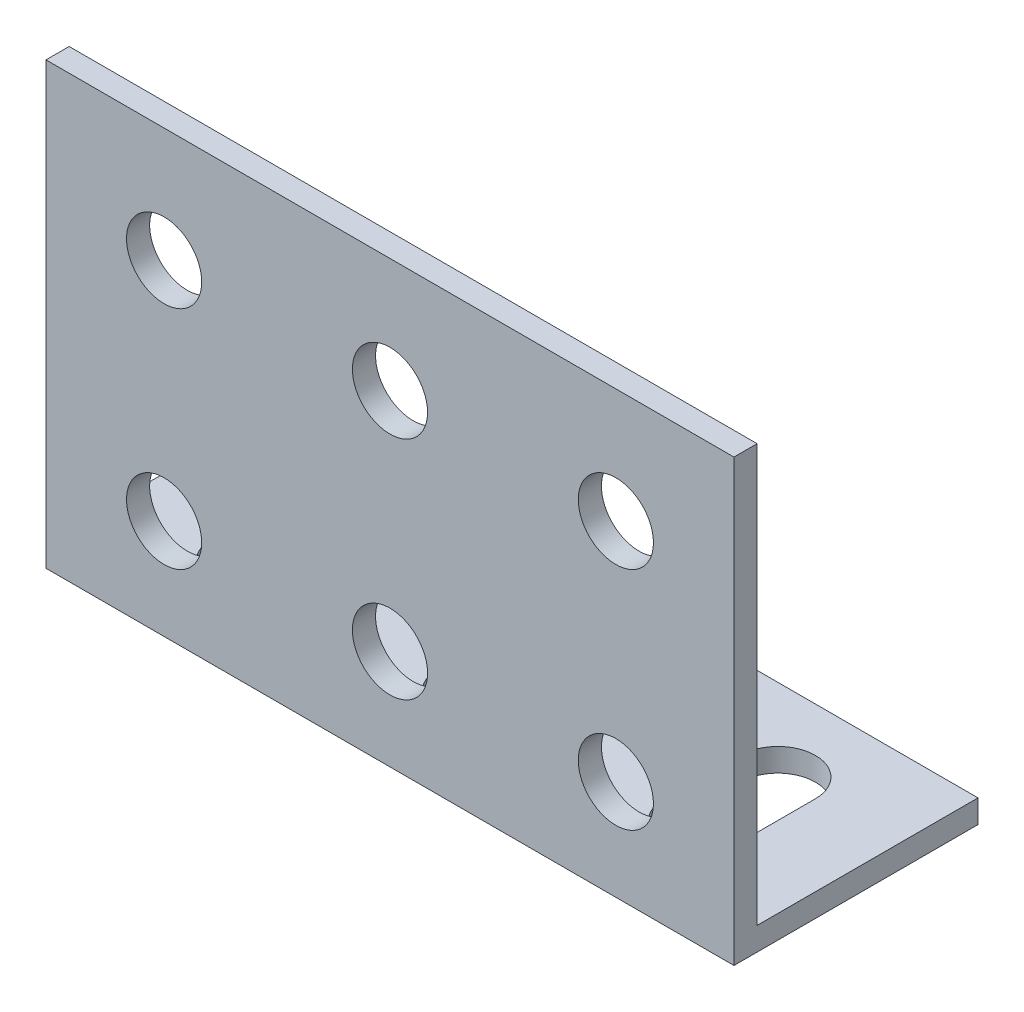
ISO-10303-21;
HEADER;
FILE_DESCRIPTION(('STEP AP214'),'2;1');
FILE_NAME('part.step','',(''),(''),'','','');
FILE_SCHEMA(('AUTOMOTIVE_DESIGN { 1 0 10303 214 1 1 1 1 }'));
ENDSEC;
DATA;
#1=APPLICATION_CONTEXT('core data for automotive mechanical design processes');
#2=APPLICATION_PROTOCOL_DEFINITION('international standard','automotive_design',2000,#1);
#3=PRODUCT_CONTEXT('',#1,'mechanical');
#4=PRODUCT('Part','Part','',(#3));
#5=PRODUCT_RELATED_PRODUCT_CATEGORY('part','',(#4));
#6=PRODUCT_DEFINITION_FORMATION('','',#4);
#7=PRODUCT_DEFINITION_CONTEXT('part definition',#1,'design');
#8=PRODUCT_DEFINITION('design','',#6,#7);
#9=PRODUCT_DEFINITION_SHAPE('','',#8);
#10=(LENGTH_UNIT() NAMED_UNIT(*) SI_UNIT(.MILLI.,.METRE.));
#11=(NAMED_UNIT(*) PLANE_ANGLE_UNIT() SI_UNIT($,.RADIAN.));
#12=(NAMED_UNIT(*) SI_UNIT($,.STERADIAN.) SOLID_ANGLE_UNIT());
#13=UNCERTAINTY_MEASURE_WITH_UNIT(LENGTH_MEASURE(1.E-05),#10,'distance_accuracy_value','');
#14=(GEOMETRIC_REPRESENTATION_CONTEXT(3) GLOBAL_UNCERTAINTY_ASSIGNED_CONTEXT((#13)) GLOBAL_UNIT_ASSIGNED_CONTEXT((#10,
#11,#12)) REPRESENTATION_CONTEXT('',''));
#15=CARTESIAN_POINT('',(0.,0.,0.));
#16=DIRECTION('',(0.,0.,1.));
#17=DIRECTION('',(1.,0.,0.));
#18=AXIS2_PLACEMENT_3D('',#15,#16,#17);
#19=CARTESIAN_POINT('',(0.,0.,-1.3));
#20=DIRECTION('',(0.,0.,1.));
#21=DIRECTION('',(1.,0.,0.));
#22=AXIS2_PLACEMENT_3D('',#19,#20,#21);
#23=PLANE('',#22);
#24=CARTESIAN_POINT('',(-33.952112536117,10.9265298567999,-1.3));
#25=DIRECTION('',(0.,0.,1.));
#26=DIRECTION('',(1.,0.,0.));
#27=AXIS2_PLACEMENT_3D('',#24,#25,#26);
#28=CIRCLE('',#27,2.11);
#29=CARTESIAN_POINT('',(-31.842112536117,10.9265298567999,-1.3));
#30=VERTEX_POINT('',#29);
#31=EDGE_CURVE('E84',#30,#30,#28,.T.);
#32=ORIENTED_EDGE('',*,*,#31,.T.);
#33=EDGE_LOOP('',(#32));
#34=FACE_BOUND('',#33,.T.);
#35=CARTESIAN_POINT('',(-21.272112536117,10.9265298567999,-1.3));
#36=DIRECTION('',(0.,0.,1.));
#37=DIRECTION('',(1.,0.,0.));
#38=AXIS2_PLACEMENT_3D('',#35,#36,#37);
#39=CIRCLE('',#38,2.11);
#40=CARTESIAN_POINT('',(-19.162112536117,10.9265298567999,-1.3));
#41=VERTEX_POINT('',#40);
#42=EDGE_CURVE('E163',#41,#41,#39,.T.);
#43=ORIENTED_EDGE('',*,*,#42,.T.);
#44=EDGE_LOOP('',(#43));
#45=FACE_BOUND('',#44,.T.);
#46=CARTESIAN_POINT('',(-8.592112536117,10.9265298567999,-1.3));
#47=DIRECTION('',(0.,0.,1.));
#48=DIRECTION('',(1.,0.,0.));
#49=AXIS2_PLACEMENT_3D('',#46,#47,#48);
#50=CIRCLE('',#49,2.11);
#51=CARTESIAN_POINT('',(-6.482112536117,10.9265298567999,-1.3));
#52=VERTEX_POINT('',#51);
#53=EDGE_CURVE('E157',#52,#52,#50,.T.);
#54=ORIENTED_EDGE('',*,*,#53,.T.);
#55=EDGE_LOOP('',(#54));
#56=FACE_BOUND('',#55,.T.);
#57=CARTESIAN_POINT('',(-21.2721125361169,-1.75347014320015,-1.3));
#58=DIRECTION('',(0.,0.,1.));
#59=DIRECTION('',(1.,0.,0.));
#60=AXIS2_PLACEMENT_3D('',#57,#58,#59);
#61=CIRCLE('',#60,2.11);
#62=CARTESIAN_POINT('',(-19.1621125361169,-1.75347014320015,-1.3));
#63=VERTEX_POINT('',#62);
#64=EDGE_CURVE('E151',#63,#63,#61,.T.);
#65=ORIENTED_EDGE('',*,*,#64,.T.);
#66=EDGE_LOOP('',(#65));
#67=FACE_BOUND('',#66,.T.);
#68=CARTESIAN_POINT('',(-8.59211253611687,-1.75347014320015,-1.3));
#69=DIRECTION('',(0.,0.,1.));
#70=DIRECTION('',(1.,0.,0.));
#71=AXIS2_PLACEMENT_3D('',#68,#69,#70);
#72=CIRCLE('',#71,2.11);
#73=CARTESIAN_POINT('',(-6.48211253611687,-1.75347014320015,-1.3));
#74=VERTEX_POINT('',#73);
#75=EDGE_CURVE('E145',#74,#74,#72,.T.);
#76=ORIENTED_EDGE('',*,*,#75,.T.);
#77=EDGE_LOOP('',(#76));
#78=FACE_BOUND('',#77,.T.);
#79=CARTESIAN_POINT('',(-33.9521125361169,-1.75347014320015,-1.3));
#80=DIRECTION('',(0.,0.,1.));
#81=DIRECTION('',(1.,0.,0.));
#82=AXIS2_PLACEMENT_3D('',#79,#80,#81);
#83=CIRCLE('',#82,2.11);
#84=CARTESIAN_POINT('',(-31.8421125361169,-1.75347014320015,-1.3));
#85=VERTEX_POINT('',#84);
#86=EDGE_CURVE('E139',#85,#85,#83,.T.);
#87=ORIENTED_EDGE('',*,*,#86,.T.);
#88=EDGE_LOOP('',(#87));
#89=FACE_BOUND('',#88,.T.);
#90=DIRECTION('',(1.,0.,0.));
#91=VECTOR('',#90,1.);
#92=CARTESIAN_POINT('',(0.,-6.06347014320015,-1.3));
#93=LINE('',#92,#91);
#94=CARTESIAN_POINT('',(-40.582112536117,-6.06347014320015,-1.3));
#95=VERTEX_POINT('',#94);
#96=CARTESIAN_POINT('',(-1.96211253611701,-6.06347014320015,-1.3));
#97=VERTEX_POINT('',#96);
#98=EDGE_CURVE('E134',#95,#97,#93,.T.);
#99=ORIENTED_EDGE('',*,*,#98,.F.);
#100=DIRECTION('',(0.,-1.,0.));
#101=VECTOR('',#100,1.);
#102=CARTESIAN_POINT('',(-40.582112536117,17.3565298567999,-1.3));
#103=LINE('',#102,#101);
#104=CARTESIAN_POINT('',(-40.582112536117,17.3565298567999,-1.3));
#105=VERTEX_POINT('',#104);
#106=EDGE_CURVE('E88',#105,#95,#103,.T.);
#107=ORIENTED_EDGE('',*,*,#106,.F.);
#108=DIRECTION('',(-1.,0.,0.));
#109=VECTOR('',#108,1.);
#110=CARTESIAN_POINT('',(-40.582112536117,17.3565298567999,-1.3));
#111=LINE('',#110,#109);
#112=CARTESIAN_POINT('',(-1.96211253611701,17.3565298567999,-1.3));
#113=VERTEX_POINT('',#112);
#114=EDGE_CURVE('E77',#113,#105,#111,.T.);
#115=ORIENTED_EDGE('',*,*,#114,.F.);
#116=DIRECTION('',(0.,1.,0.));
#117=VECTOR('',#116,1.);
#118=CARTESIAN_POINT('',(-1.96211253611701,17.3565298567999,-1.3));
#119=LINE('',#118,#117);
#120=EDGE_CURVE('E90',#97,#113,#119,.T.);
#121=ORIENTED_EDGE('',*,*,#120,.F.);
#122=EDGE_LOOP('',(#99,#107,#115,#121));
#123=FACE_BOUND('',#122,.T.);
#124=ADVANCED_FACE('F33',(#34,#45,#56,#67,#78,#89,#123),#23,.F.);
#125=CARTESIAN_POINT('',(-40.582112536117,17.3565298567999,-1.3));
#126=DIRECTION('',(-1.,0.,0.));
#127=DIRECTION('',(0.,0.,1.));
#128=AXIS2_PLACEMENT_3D('',#125,#126,#127);
#129=PLANE('',#128);
#130=DIRECTION('',(0.,0.,1.));
#131=VECTOR('',#130,1.);
#132=CARTESIAN_POINT('',(-40.582112536117,-7.36347014320015,-1.3));
#133=LINE('',#132,#131);
#134=CARTESIAN_POINT('',(-40.582112536117,-7.36347014320015,-13.7));
#135=VERTEX_POINT('',#134);
#136=CARTESIAN_POINT('',(-40.582112536117,-7.36347014320015,0.));
#137=VERTEX_POINT('',#136);
#138=EDGE_CURVE('E37',#135,#137,#133,.T.);
#139=ORIENTED_EDGE('',*,*,#138,.T.);
#140=DIRECTION('',(0.,-1.,0.));
#141=VECTOR('',#140,1.);
#142=CARTESIAN_POINT('',(-40.582112536117,17.3565298567999,0.));
#143=LINE('',#142,#141);
#144=CARTESIAN_POINT('',(-40.582112536117,17.3565298567999,0.));
#145=VERTEX_POINT('',#144);
#146=EDGE_CURVE('E79',#145,#137,#143,.T.);
#147=ORIENTED_EDGE('',*,*,#146,.F.);
#148=DIRECTION('',(0.,0.,1.));
#149=VECTOR('',#148,1.);
#150=CARTESIAN_POINT('',(-40.582112536117,17.3565298567999,-1.3));
#151=LINE('',#150,#149);
#152=EDGE_CURVE('E11',#105,#145,#151,.T.);
#153=ORIENTED_EDGE('',*,*,#152,.F.);
#154=ORIENTED_EDGE('',*,*,#106,.T.);
#155=DIRECTION('',(0.,0.,-1.));
#156=VECTOR('',#155,1.);
#157=CARTESIAN_POINT('',(-40.582112536117,-6.06347014320015,0.));
#158=LINE('',#157,#156);
#159=CARTESIAN_POINT('',(-40.582112536117,-6.06347014320015,-13.7));
#160=VERTEX_POINT('',#159);
#161=EDGE_CURVE('E114',#95,#160,#158,.T.);
#162=ORIENTED_EDGE('',*,*,#161,.T.);
#163=DIRECTION('',(0.,-1.,0.));
#164=VECTOR('',#163,1.);
#165=CARTESIAN_POINT('',(-40.582112536117,-6.06347014320015,-13.7));
#166=LINE('',#165,#164);
#167=EDGE_CURVE('E111',#160,#135,#166,.T.);
#168=ORIENTED_EDGE('',*,*,#167,.T.);
#169=EDGE_LOOP('',(#139,#147,#153,#154,#162,#168));
#170=FACE_BOUND('',#169,.T.);
#171=ADVANCED_FACE('F35',(#170),#129,.T.);
#172=CARTESIAN_POINT('',(-40.582112536117,17.3565298567999,-1.3));
#173=DIRECTION('',(0.,1.,0.));
#174=DIRECTION('',(0.,0.,1.));
#175=AXIS2_PLACEMENT_3D('',#172,#173,#174);
#176=PLANE('',#175);
#177=DIRECTION('',(-1.,0.,0.));
#178=VECTOR('',#177,1.);
#179=CARTESIAN_POINT('',(-40.582112536117,17.3565298567999,0.));
#180=LINE('',#179,#178);
#181=CARTESIAN_POINT('',(-1.96211253611701,17.3565298567999,0.));
#182=VERTEX_POINT('',#181);
#183=EDGE_CURVE('E75',#182,#145,#180,.T.);
#184=ORIENTED_EDGE('',*,*,#183,.F.);
#185=DIRECTION('',(0.,0.,1.));
#186=VECTOR('',#185,1.);
#187=CARTESIAN_POINT('',(-1.96211253611701,17.3565298567999,-1.3));
#188=LINE('',#187,#186);
#189=EDGE_CURVE('E43',#113,#182,#188,.T.);
#190=ORIENTED_EDGE('',*,*,#189,.F.);
#191=ORIENTED_EDGE('',*,*,#114,.T.);
#192=ORIENTED_EDGE('',*,*,#152,.T.);
#193=EDGE_LOOP('',(#184,#190,#191,#192));
#194=FACE_BOUND('',#193,.T.);
#195=ADVANCED_FACE('F73',(#194),#176,.T.);
#196=CARTESIAN_POINT('',(-1.96211253611701,17.3565298567999,-1.3));
#197=DIRECTION('',(1.,0.,0.));
#198=DIRECTION('',(0.,0.,-1.));
#199=AXIS2_PLACEMENT_3D('',#196,#197,#198);
#200=PLANE('',#199);
#201=DIRECTION('',(0.,0.,1.));
#202=VECTOR('',#201,1.);
#203=CARTESIAN_POINT('',(-1.96211253611701,-6.06347014320015,0.));
#204=LINE('',#203,#202);
#205=CARTESIAN_POINT('',(-1.96211253611701,-6.06347014320015,-13.7));
#206=VERTEX_POINT('',#205);
#207=EDGE_CURVE('E119',#206,#97,#204,.T.);
#208=ORIENTED_EDGE('',*,*,#207,.T.);
#209=ORIENTED_EDGE('',*,*,#120,.T.);
#210=ORIENTED_EDGE('',*,*,#189,.T.);
#211=DIRECTION('',(0.,1.,0.));
#212=VECTOR('',#211,1.);
#213=CARTESIAN_POINT('',(-1.96211253611701,17.3565298567999,0.));
#214=LINE('',#213,#212);
#215=CARTESIAN_POINT('',(-1.96211253611701,-7.36347014320015,0.));
#216=VERTEX_POINT('',#215);
#217=EDGE_CURVE('E68',#216,#182,#214,.T.);
#218=ORIENTED_EDGE('',*,*,#217,.F.);
#219=DIRECTION('',(0.,0.,1.));
#220=VECTOR('',#219,1.);
#221=CARTESIAN_POINT('',(-1.96211253611701,-7.36347014320015,-1.3));
#222=LINE('',#221,#220);
#223=CARTESIAN_POINT('',(-1.96211253611701,-7.36347014320015,-13.7));
#224=VERTEX_POINT('',#223);
#225=EDGE_CURVE('E95',#224,#216,#222,.T.);
#226=ORIENTED_EDGE('',*,*,#225,.F.);
#227=DIRECTION('',(0.,-1.,0.));
#228=VECTOR('',#227,1.);
#229=CARTESIAN_POINT('',(-1.96211253611701,-6.06347014320015,-13.7));
#230=LINE('',#229,#228);
#231=EDGE_CURVE('E118',#206,#224,#230,.T.);
#232=ORIENTED_EDGE('',*,*,#231,.F.);
#233=EDGE_LOOP('',(#208,#209,#210,#218,#226,#232));
#234=FACE_BOUND('',#233,.T.);
#235=ADVANCED_FACE('F185',(#234),#200,.T.);
#236=CARTESIAN_POINT('',(-40.582112536117,-7.36347014320015,-1.3));
#237=DIRECTION('',(0.,-1.,0.));
#238=DIRECTION('',(0.,0.,-1.));
#239=AXIS2_PLACEMENT_3D('',#236,#237,#238);
#240=PLANE('',#239);
#241=DIRECTION('',(1.,0.,0.));
#242=VECTOR('',#241,1.);
#243=CARTESIAN_POINT('',(-40.582112536117,-7.36347014320015,0.));
#244=LINE('',#243,#242);
#245=EDGE_CURVE('E83',#137,#216,#244,.T.);
#246=ORIENTED_EDGE('',*,*,#245,.F.);
#247=ORIENTED_EDGE('',*,*,#138,.F.);
#248=DIRECTION('',(1.,0.,0.));
#249=VECTOR('',#248,1.);
#250=CARTESIAN_POINT('',(-40.582112536117,-7.36347014320015,-13.7));
#251=LINE('',#250,#249);
#252=EDGE_CURVE('E106',#135,#224,#251,.T.);
#253=ORIENTED_EDGE('',*,*,#252,.T.);
#254=ORIENTED_EDGE('',*,*,#225,.T.);
#255=EDGE_LOOP('',(#246,#247,#253,#254));
#256=FACE_BOUND('',#255,.T.);
#257=CARTESIAN_POINT('',(-33.952112536117,-7.36347014320015,-4.79140445900367));
#258=DIRECTION('',(0.,-1.,0.));
#259=DIRECTION('',(0.,0.,-1.));
#260=AXIS2_PLACEMENT_3D('',#257,#258,#259);
#261=CIRCLE('',#260,2.11);
#262=CARTESIAN_POINT('',(-31.842112536117,-7.36347014320015,-4.79140445900367));
#263=VERTEX_POINT('',#262);
#264=CARTESIAN_POINT('',(-36.062112536117,-7.36347014320015,-4.79140445900367));
#265=VERTEX_POINT('',#264);
#266=EDGE_CURVE('E342',#263,#265,#261,.T.);
#267=ORIENTED_EDGE('',*,*,#266,.F.);
#268=DIRECTION('',(0.,0.,1.));
#269=VECTOR('',#268,1.);
#270=CARTESIAN_POINT('',(-31.842112536117,-7.36347014320015,-4.79140445900367));
#271=LINE('',#270,#269);
#272=CARTESIAN_POINT('',(-31.842112536117,-7.36347014320015,-9.09140445900367));
#273=VERTEX_POINT('',#272);
#274=EDGE_CURVE('E355',#273,#263,#271,.T.);
#275=ORIENTED_EDGE('',*,*,#274,.F.);
#276=CARTESIAN_POINT('',(-33.952112536117,-7.36347014320015,-9.09140445900367));
#277=DIRECTION('',(0.,-1.,0.));
#278=DIRECTION('',(0.,0.,-1.));
#279=AXIS2_PLACEMENT_3D('',#276,#277,#278);
#280=CIRCLE('',#279,2.11);
#281=CARTESIAN_POINT('',(-36.062112536117,-7.36347014320015,-9.09140445900367));
#282=VERTEX_POINT('',#281);
#283=EDGE_CURVE('E370',#282,#273,#280,.T.);
#284=ORIENTED_EDGE('',*,*,#283,.F.);
#285=DIRECTION('',(0.,0.,-1.));
#286=VECTOR('',#285,1.);
#287=CARTESIAN_POINT('',(-36.062112536117,-7.36347014320015,-4.79140445900367));
#288=LINE('',#287,#286);
#289=EDGE_CURVE('E367',#265,#282,#288,.T.);
#290=ORIENTED_EDGE('',*,*,#289,.F.);
#291=EDGE_LOOP('',(#267,#275,#284,#290));
#292=FACE_BOUND('',#291,.T.);
#293=CARTESIAN_POINT('',(-21.272112536117,-7.36347014320015,-4.79140445900367));
#294=DIRECTION('',(0.,-1.,0.));
#295=DIRECTION('',(0.,0.,-1.));
#296=AXIS2_PLACEMENT_3D('',#293,#294,#295);
#297=CIRCLE('',#296,2.10999999999999);
#298=CARTESIAN_POINT('',(-19.162112536117,-7.36347014320015,-4.79140445900367));
#299=VERTEX_POINT('',#298);
#300=CARTESIAN_POINT('',(-23.382112536117,-7.36347014320015,-4.79140445900367));
#301=VERTEX_POINT('',#300);
#302=EDGE_CURVE('E308',#299,#301,#297,.T.);
#303=ORIENTED_EDGE('',*,*,#302,.F.);
#304=DIRECTION('',(0.,0.,1.));
#305=VECTOR('',#304,1.);
#306=CARTESIAN_POINT('',(-19.162112536117,-7.36347014320015,-4.79140445900367));
#307=LINE('',#306,#305);
#308=CARTESIAN_POINT('',(-19.162112536117,-7.36347014320015,-9.09140445900367));
#309=VERTEX_POINT('',#308);
#310=EDGE_CURVE('E319',#309,#299,#307,.T.);
#311=ORIENTED_EDGE('',*,*,#310,.F.);
#312=CARTESIAN_POINT('',(-21.272112536117,-7.36347014320015,-9.09140445900367));
#313=DIRECTION('',(0.,-1.,0.));
#314=DIRECTION('',(0.,0.,-1.));
#315=AXIS2_PLACEMENT_3D('',#312,#313,#314);
#316=CIRCLE('',#315,2.10999999999999);
#317=CARTESIAN_POINT('',(-23.382112536117,-7.36347014320015,-9.09140445900367));
#318=VERTEX_POINT('',#317);
#319=EDGE_CURVE('E334',#318,#309,#316,.T.);
#320=ORIENTED_EDGE('',*,*,#319,.F.);
#321=DIRECTION('',(0.,0.,-1.));
#322=VECTOR('',#321,1.);
#323=CARTESIAN_POINT('',(-23.382112536117,-7.36347014320015,-4.79140445900367));
#324=LINE('',#323,#322);
#325=EDGE_CURVE('E331',#301,#318,#324,.T.);
#326=ORIENTED_EDGE('',*,*,#325,.F.);
#327=EDGE_LOOP('',(#303,#311,#320,#326));
#328=FACE_BOUND('',#327,.T.);
#329=CARTESIAN_POINT('',(-8.59211253611704,-7.36347014320015,-4.79140445900367));
#330=DIRECTION('',(0.,-1.,0.));
#331=DIRECTION('',(0.,0.,-1.));
#332=AXIS2_PLACEMENT_3D('',#329,#330,#331);
#333=CIRCLE('',#332,2.11);
#334=CARTESIAN_POINT('',(-6.48211253611704,-7.36347014320015,-4.79140445900367));
#335=VERTEX_POINT('',#334);
#336=CARTESIAN_POINT('',(-10.702112536117,-7.36347014320015,-4.79140445900367));
#337=VERTEX_POINT('',#336);
#338=EDGE_CURVE('E294',#335,#337,#333,.T.);
#339=ORIENTED_EDGE('',*,*,#338,.F.);
#340=DIRECTION('',(0.,0.,1.));
#341=VECTOR('',#340,1.);
#342=CARTESIAN_POINT('',(-6.48211253611704,-7.36347014320015,-4.79140445900367));
#343=LINE('',#342,#341);
#344=CARTESIAN_POINT('',(-6.48211253611704,-7.36347014320015,-9.09140445900367));
#345=VERTEX_POINT('',#344);
#346=EDGE_CURVE('E274',#345,#335,#343,.T.);
#347=ORIENTED_EDGE('',*,*,#346,.F.);
#348=CARTESIAN_POINT('',(-8.59211253611705,-7.36347014320015,-9.09140445900367));
#349=DIRECTION('',(0.,-1.,0.));
#350=DIRECTION('',(0.,0.,-1.));
#351=AXIS2_PLACEMENT_3D('',#348,#349,#350);
#352=CIRCLE('',#351,2.11);
#353=CARTESIAN_POINT('',(-10.702112536117,-7.36347014320015,-9.09140445900367));
#354=VERTEX_POINT('',#353);
#355=EDGE_CURVE('E290',#354,#345,#352,.T.);
#356=ORIENTED_EDGE('',*,*,#355,.F.);
#357=DIRECTION('',(0.,0.,-1.));
#358=VECTOR('',#357,1.);
#359=CARTESIAN_POINT('',(-10.702112536117,-7.36347014320015,-4.79140445900367));
#360=LINE('',#359,#358);
#361=EDGE_CURVE('E297',#337,#354,#360,.T.);
#362=ORIENTED_EDGE('',*,*,#361,.F.);
#363=EDGE_LOOP('',(#339,#347,#356,#362));
#364=FACE_BOUND('',#363,.T.);
#365=ADVANCED_FACE('F101',(#256,#292,#328,#364),#240,.T.);
#366=CARTESIAN_POINT('',(0.,0.,0.));
#367=DIRECTION('',(0.,0.,1.));
#368=DIRECTION('',(1.,0.,0.));
#369=AXIS2_PLACEMENT_3D('',#366,#367,#368);
#370=PLANE('',#369);
#371=ORIENTED_EDGE('',*,*,#217,.T.);
#372=ORIENTED_EDGE('',*,*,#183,.T.);
#373=ORIENTED_EDGE('',*,*,#146,.T.);
#374=ORIENTED_EDGE('',*,*,#245,.T.);
#375=EDGE_LOOP('',(#371,#372,#373,#374));
#376=FACE_BOUND('',#375,.T.);
#377=CARTESIAN_POINT('',(-33.9521125361169,-1.75347014320015,0.));
#378=DIRECTION('',(0.,0.,1.));
#379=DIRECTION('',(1.,0.,0.));
#380=AXIS2_PLACEMENT_3D('',#377,#378,#379);
#381=CIRCLE('',#380,2.11);
#382=CARTESIAN_POINT('',(-31.8421125361169,-1.75347014320015,0.));
#383=VERTEX_POINT('',#382);
#384=EDGE_CURVE('E138',#383,#383,#381,.T.);
#385=ORIENTED_EDGE('',*,*,#384,.F.);
#386=EDGE_LOOP('',(#385));
#387=FACE_BOUND('',#386,.T.);
#388=CARTESIAN_POINT('',(-8.59211253611687,-1.75347014320015,0.));
#389=DIRECTION('',(0.,0.,1.));
#390=DIRECTION('',(1.,0.,0.));
#391=AXIS2_PLACEMENT_3D('',#388,#389,#390);
#392=CIRCLE('',#391,2.11);
#393=CARTESIAN_POINT('',(-6.48211253611687,-1.75347014320015,0.));
#394=VERTEX_POINT('',#393);
#395=EDGE_CURVE('E142',#394,#394,#392,.T.);
#396=ORIENTED_EDGE('',*,*,#395,.F.);
#397=EDGE_LOOP('',(#396));
#398=FACE_BOUND('',#397,.T.);
#399=CARTESIAN_POINT('',(-21.2721125361169,-1.75347014320015,0.));
#400=DIRECTION('',(0.,0.,1.));
#401=DIRECTION('',(1.,0.,0.));
#402=AXIS2_PLACEMENT_3D('',#399,#400,#401);
#403=CIRCLE('',#402,2.11);
#404=CARTESIAN_POINT('',(-19.1621125361169,-1.75347014320015,0.));
#405=VERTEX_POINT('',#404);
#406=EDGE_CURVE('E148',#405,#405,#403,.T.);
#407=ORIENTED_EDGE('',*,*,#406,.F.);
#408=EDGE_LOOP('',(#407));
#409=FACE_BOUND('',#408,.T.);
#410=CARTESIAN_POINT('',(-8.592112536117,10.9265298567999,0.));
#411=DIRECTION('',(0.,0.,1.));
#412=DIRECTION('',(1.,0.,0.));
#413=AXIS2_PLACEMENT_3D('',#410,#411,#412);
#414=CIRCLE('',#413,2.11);
#415=CARTESIAN_POINT('',(-6.482112536117,10.9265298567999,0.));
#416=VERTEX_POINT('',#415);
#417=EDGE_CURVE('E154',#416,#416,#414,.T.);
#418=ORIENTED_EDGE('',*,*,#417,.F.);
#419=EDGE_LOOP('',(#418));
#420=FACE_BOUND('',#419,.T.);
#421=CARTESIAN_POINT('',(-21.272112536117,10.9265298567999,0.));
#422=DIRECTION('',(0.,0.,1.));
#423=DIRECTION('',(1.,0.,0.));
#424=AXIS2_PLACEMENT_3D('',#421,#422,#423);
#425=CIRCLE('',#424,2.11);
#426=CARTESIAN_POINT('',(-19.162112536117,10.9265298567999,0.));
#427=VERTEX_POINT('',#426);
#428=EDGE_CURVE('E160',#427,#427,#425,.T.);
#429=ORIENTED_EDGE('',*,*,#428,.F.);
#430=EDGE_LOOP('',(#429));
#431=FACE_BOUND('',#430,.T.);
#432=CARTESIAN_POINT('',(-33.952112536117,10.9265298567999,0.));
#433=DIRECTION('',(0.,0.,1.));
#434=DIRECTION('',(1.,0.,0.));
#435=AXIS2_PLACEMENT_3D('',#432,#433,#434);
#436=CIRCLE('',#435,2.11);
#437=CARTESIAN_POINT('',(-31.842112536117,10.9265298567999,0.));
#438=VERTEX_POINT('',#437);
#439=EDGE_CURVE('E166',#438,#438,#436,.T.);
#440=ORIENTED_EDGE('',*,*,#439,.F.);
#441=EDGE_LOOP('',(#440));
#442=FACE_BOUND('',#441,.T.);
#443=ADVANCED_FACE('F86',(#376,#387,#398,#409,#420,#431,#442),#370,.T.);
#444=CARTESIAN_POINT('',(-33.952112536117,10.9265298567999,-1.3));
#445=DIRECTION('',(0.,0.,1.));
#446=DIRECTION('',(1.,0.,0.));
#447=AXIS2_PLACEMENT_3D('',#444,#445,#446);
#448=CYLINDRICAL_SURFACE('',#447,2.11);
#449=ORIENTED_EDGE('',*,*,#31,.F.);
#450=EDGE_LOOP('',(#449));
#451=FACE_BOUND('',#450,.T.);
#452=ORIENTED_EDGE('',*,*,#439,.T.);
#453=EDGE_LOOP('',(#452));
#454=FACE_BOUND('',#453,.T.);
#455=ADVANCED_FACE('F174',(#451,#454),#448,.F.);
#456=CARTESIAN_POINT('',(-21.272112536117,10.9265298567999,-1.3));
#457=DIRECTION('',(0.,0.,1.));
#458=DIRECTION('',(1.,0.,0.));
#459=AXIS2_PLACEMENT_3D('',#456,#457,#458);
#460=CYLINDRICAL_SURFACE('',#459,2.11);
#461=ORIENTED_EDGE('',*,*,#42,.F.);
#462=EDGE_LOOP('',(#461));
#463=FACE_BOUND('',#462,.T.);
#464=ORIENTED_EDGE('',*,*,#428,.T.);
#465=EDGE_LOOP('',(#464));
#466=FACE_BOUND('',#465,.T.);
#467=ADVANCED_FACE('F182',(#463,#466),#460,.F.);
#468=CARTESIAN_POINT('',(-8.592112536117,10.9265298567999,-1.3));
#469=DIRECTION('',(0.,0.,1.));
#470=DIRECTION('',(1.,0.,0.));
#471=AXIS2_PLACEMENT_3D('',#468,#469,#470);
#472=CYLINDRICAL_SURFACE('',#471,2.11);
#473=ORIENTED_EDGE('',*,*,#53,.F.);
#474=EDGE_LOOP('',(#473));
#475=FACE_BOUND('',#474,.T.);
#476=ORIENTED_EDGE('',*,*,#417,.T.);
#477=EDGE_LOOP('',(#476));
#478=FACE_BOUND('',#477,.T.);
#479=ADVANCED_FACE('F197',(#475,#478),#472,.F.);
#480=CARTESIAN_POINT('',(-21.2721125361169,-1.75347014320015,-1.3));
#481=DIRECTION('',(0.,0.,1.));
#482=DIRECTION('',(1.,0.,0.));
#483=AXIS2_PLACEMENT_3D('',#480,#481,#482);
#484=CYLINDRICAL_SURFACE('',#483,2.11);
#485=ORIENTED_EDGE('',*,*,#64,.F.);
#486=EDGE_LOOP('',(#485));
#487=FACE_BOUND('',#486,.T.);
#488=ORIENTED_EDGE('',*,*,#406,.T.);
#489=EDGE_LOOP('',(#488));
#490=FACE_BOUND('',#489,.T.);
#491=ADVANCED_FACE('F201',(#487,#490),#484,.F.);
#492=CARTESIAN_POINT('',(-8.59211253611687,-1.75347014320015,-1.3));
#493=DIRECTION('',(0.,0.,1.));
#494=DIRECTION('',(1.,0.,0.));
#495=AXIS2_PLACEMENT_3D('',#492,#493,#494);
#496=CYLINDRICAL_SURFACE('',#495,2.11);
#497=ORIENTED_EDGE('',*,*,#75,.F.);
#498=EDGE_LOOP('',(#497));
#499=FACE_BOUND('',#498,.T.);
#500=ORIENTED_EDGE('',*,*,#395,.T.);
#501=EDGE_LOOP('',(#500));
#502=FACE_BOUND('',#501,.T.);
#503=ADVANCED_FACE('F205',(#499,#502),#496,.F.);
#504=CARTESIAN_POINT('',(-33.9521125361169,-1.75347014320015,-1.3));
#505=DIRECTION('',(0.,0.,1.));
#506=DIRECTION('',(1.,0.,0.));
#507=AXIS2_PLACEMENT_3D('',#504,#505,#506);
#508=CYLINDRICAL_SURFACE('',#507,2.11);
#509=ORIENTED_EDGE('',*,*,#86,.F.);
#510=EDGE_LOOP('',(#509));
#511=FACE_BOUND('',#510,.T.);
#512=ORIENTED_EDGE('',*,*,#384,.T.);
#513=EDGE_LOOP('',(#512));
#514=FACE_BOUND('',#513,.T.);
#515=ADVANCED_FACE('F209',(#511,#514),#508,.F.);
#516=CARTESIAN_POINT('',(0.,-6.06347014320015,0.));
#517=DIRECTION('',(0.,-1.,0.));
#518=DIRECTION('',(0.,0.,-1.));
#519=AXIS2_PLACEMENT_3D('',#516,#517,#518);
#520=PLANE('',#519);
#521=DIRECTION('',(0.,0.,1.));
#522=VECTOR('',#521,1.);
#523=CARTESIAN_POINT('',(-6.48211253611704,-6.06347014320015,-4.79140445900367));
#524=LINE('',#523,#522);
#525=CARTESIAN_POINT('',(-6.48211253611704,-6.06347014320015,-9.09140445900367));
#526=VERTEX_POINT('',#525);
#527=CARTESIAN_POINT('',(-6.48211253611704,-6.06347014320015,-4.79140445900367));
#528=VERTEX_POINT('',#527);
#529=EDGE_CURVE('E303',#526,#528,#524,.T.);
#530=ORIENTED_EDGE('',*,*,#529,.T.);
#531=CARTESIAN_POINT('',(-8.59211253611704,-6.06347014320015,-4.79140445900367));
#532=DIRECTION('',(0.,-1.,0.));
#533=DIRECTION('',(0.,0.,-1.));
#534=AXIS2_PLACEMENT_3D('',#531,#532,#533);
#535=CIRCLE('',#534,2.11);
#536=CARTESIAN_POINT('',(-10.702112536117,-6.06347014320015,-4.79140445900367));
#537=VERTEX_POINT('',#536);
#538=EDGE_CURVE('E289',#528,#537,#535,.T.);
#539=ORIENTED_EDGE('',*,*,#538,.T.);
#540=DIRECTION('',(0.,0.,-1.));
#541=VECTOR('',#540,1.);
#542=CARTESIAN_POINT('',(-10.702112536117,-6.06347014320015,-4.79140445900367));
#543=LINE('',#542,#541);
#544=CARTESIAN_POINT('',(-10.702112536117,-6.06347014320015,-9.09140445900367));
#545=VERTEX_POINT('',#544);
#546=EDGE_CURVE('E449',#537,#545,#543,.T.);
#547=ORIENTED_EDGE('',*,*,#546,.T.);
#548=CARTESIAN_POINT('',(-8.59211253611705,-6.06347014320015,-9.09140445900367));
#549=DIRECTION('',(0.,-1.,0.));
#550=DIRECTION('',(0.,0.,-1.));
#551=AXIS2_PLACEMENT_3D('',#548,#549,#550);
#552=CIRCLE('',#551,2.11);
#553=EDGE_CURVE('E451',#545,#526,#552,.T.);
#554=ORIENTED_EDGE('',*,*,#553,.T.);
#555=EDGE_LOOP('',(#530,#539,#547,#554));
#556=FACE_BOUND('',#555,.T.);
#557=DIRECTION('',(0.,0.,1.));
#558=VECTOR('',#557,1.);
#559=CARTESIAN_POINT('',(-19.162112536117,-6.06347014320015,-4.79140445900367));
#560=LINE('',#559,#558);
#561=CARTESIAN_POINT('',(-19.162112536117,-6.06347014320015,-9.09140445900367));
#562=VERTEX_POINT('',#561);
#563=CARTESIAN_POINT('',(-19.162112536117,-6.06347014320015,-4.79140445900367));
#564=VERTEX_POINT('',#563);
#565=EDGE_CURVE('E325',#562,#564,#560,.T.);
#566=ORIENTED_EDGE('',*,*,#565,.T.);
#567=CARTESIAN_POINT('',(-21.272112536117,-6.06347014320015,-4.79140445900367));
#568=DIRECTION('',(0.,-1.,0.));
#569=DIRECTION('',(0.,0.,-1.));
#570=AXIS2_PLACEMENT_3D('',#567,#568,#569);
#571=CIRCLE('',#570,2.10999999999999);
#572=CARTESIAN_POINT('',(-23.382112536117,-6.06347014320015,-4.79140445900367));
#573=VERTEX_POINT('',#572);
#574=EDGE_CURVE('E315',#564,#573,#571,.T.);
#575=ORIENTED_EDGE('',*,*,#574,.T.);
#576=DIRECTION('',(0.,0.,-1.));
#577=VECTOR('',#576,1.);
#578=CARTESIAN_POINT('',(-23.382112536117,-6.06347014320015,-4.79140445900367));
#579=LINE('',#578,#577);
#580=CARTESIAN_POINT('',(-23.382112536117,-6.06347014320015,-9.09140445900367));
#581=VERTEX_POINT('',#580);
#582=EDGE_CURVE('E318',#573,#581,#579,.T.);
#583=ORIENTED_EDGE('',*,*,#582,.T.);
#584=CARTESIAN_POINT('',(-21.272112536117,-6.06347014320015,-9.09140445900367));
#585=DIRECTION('',(0.,-1.,0.));
#586=DIRECTION('',(0.,0.,-1.));
#587=AXIS2_PLACEMENT_3D('',#584,#585,#586);
#588=CIRCLE('',#587,2.10999999999999);
#589=EDGE_CURVE('E322',#581,#562,#588,.T.);
#590=ORIENTED_EDGE('',*,*,#589,.T.);
#591=EDGE_LOOP('',(#566,#575,#583,#590));
#592=FACE_BOUND('',#591,.T.);
#593=DIRECTION('',(0.,0.,1.));
#594=VECTOR('',#593,1.);
#595=CARTESIAN_POINT('',(-31.842112536117,-6.06347014320015,-4.79140445900367));
#596=LINE('',#595,#594);
#597=CARTESIAN_POINT('',(-31.842112536117,-6.06347014320015,-9.09140445900367));
#598=VERTEX_POINT('',#597);
#599=CARTESIAN_POINT('',(-31.842112536117,-6.06347014320015,-4.79140445900367));
#600=VERTEX_POINT('',#599);
#601=EDGE_CURVE('E361',#598,#600,#596,.T.);
#602=ORIENTED_EDGE('',*,*,#601,.T.);
#603=CARTESIAN_POINT('',(-33.952112536117,-6.06347014320015,-4.79140445900367));
#604=DIRECTION('',(0.,-1.,0.));
#605=DIRECTION('',(0.,0.,-1.));
#606=AXIS2_PLACEMENT_3D('',#603,#604,#605);
#607=CIRCLE('',#606,2.11);
#608=CARTESIAN_POINT('',(-36.062112536117,-6.06347014320015,-4.79140445900367));
#609=VERTEX_POINT('',#608);
#610=EDGE_CURVE('E351',#600,#609,#607,.T.);
#611=ORIENTED_EDGE('',*,*,#610,.T.);
#612=DIRECTION('',(0.,0.,-1.));
#613=VECTOR('',#612,1.);
#614=CARTESIAN_POINT('',(-36.062112536117,-6.06347014320015,-4.79140445900367));
#615=LINE('',#614,#613);
#616=CARTESIAN_POINT('',(-36.062112536117,-6.06347014320015,-9.09140445900367));
#617=VERTEX_POINT('',#616);
#618=EDGE_CURVE('E354',#609,#617,#615,.T.);
#619=ORIENTED_EDGE('',*,*,#618,.T.);
#620=CARTESIAN_POINT('',(-33.952112536117,-6.06347014320015,-9.09140445900367));
#621=DIRECTION('',(0.,-1.,0.));
#622=DIRECTION('',(0.,0.,-1.));
#623=AXIS2_PLACEMENT_3D('',#620,#621,#622);
#624=CIRCLE('',#623,2.11);
#625=EDGE_CURVE('E358',#617,#598,#624,.T.);
#626=ORIENTED_EDGE('',*,*,#625,.T.);
#627=EDGE_LOOP('',(#602,#611,#619,#626));
#628=FACE_BOUND('',#627,.T.);
#629=ORIENTED_EDGE('',*,*,#161,.F.);
#630=ORIENTED_EDGE('',*,*,#98,.T.);
#631=ORIENTED_EDGE('',*,*,#207,.F.);
#632=DIRECTION('',(1.,0.,0.));
#633=VECTOR('',#632,1.);
#634=CARTESIAN_POINT('',(-40.582112536117,-6.06347014320015,-13.7));
#635=LINE('',#634,#633);
#636=EDGE_CURVE('E126',#160,#206,#635,.T.);
#637=ORIENTED_EDGE('',*,*,#636,.F.);
#638=EDGE_LOOP('',(#629,#630,#631,#637));
#639=FACE_BOUND('',#638,.T.);
#640=ADVANCED_FACE('F213',(#556,#592,#628,#639),#520,.F.);
#641=CARTESIAN_POINT('',(-40.582112536117,-6.06347014320015,-13.7));
#642=DIRECTION('',(0.,0.,-1.));
#643=DIRECTION('',(-1.,0.,0.));
#644=AXIS2_PLACEMENT_3D('',#641,#642,#643);
#645=PLANE('',#644);
#646=ORIENTED_EDGE('',*,*,#252,.F.);
#647=ORIENTED_EDGE('',*,*,#167,.F.);
#648=ORIENTED_EDGE('',*,*,#636,.T.);
#649=ORIENTED_EDGE('',*,*,#231,.T.);
#650=EDGE_LOOP('',(#646,#647,#648,#649));
#651=FACE_BOUND('',#650,.T.);
#652=ADVANCED_FACE('F122',(#651),#645,.T.);
#653=CARTESIAN_POINT('',(-33.952112536117,-6.06347014320015,-4.79140445900367));
#654=DIRECTION('',(0.,-1.,0.));
#655=DIRECTION('',(0.,0.,-1.));
#656=AXIS2_PLACEMENT_3D('',#653,#654,#655);
#657=CYLINDRICAL_SURFACE('',#656,2.11);
#658=ORIENTED_EDGE('',*,*,#266,.T.);
#659=DIRECTION('',(0.,-1.,0.));
#660=VECTOR('',#659,1.);
#661=CARTESIAN_POINT('',(-36.062112536117,-6.06347014320015,-4.79140445900367));
#662=LINE('',#661,#660);
#663=EDGE_CURVE('E364',#609,#265,#662,.T.);
#664=ORIENTED_EDGE('',*,*,#663,.F.);
#665=ORIENTED_EDGE('',*,*,#610,.F.);
#666=DIRECTION('',(0.,-1.,0.));
#667=VECTOR('',#666,1.);
#668=CARTESIAN_POINT('',(-31.842112536117,-6.06347014320015,-4.79140445900367));
#669=LINE('',#668,#667);
#670=EDGE_CURVE('E124',#600,#263,#669,.T.);
#671=ORIENTED_EDGE('',*,*,#670,.T.);
#672=EDGE_LOOP('',(#658,#664,#665,#671));
#673=FACE_BOUND('',#672,.T.);
#674=ADVANCED_FACE('F217',(#673),#657,.F.);
#675=CARTESIAN_POINT('',(-31.842112536117,-6.06347014320015,-4.79140445900367));
#676=DIRECTION('',(1.,0.,0.));
#677=DIRECTION('',(0.,0.,-1.));
#678=AXIS2_PLACEMENT_3D('',#675,#676,#677);
#679=PLANE('',#678);
#680=ORIENTED_EDGE('',*,*,#274,.T.);
#681=ORIENTED_EDGE('',*,*,#670,.F.);
#682=ORIENTED_EDGE('',*,*,#601,.F.);
#683=DIRECTION('',(0.,-1.,0.));
#684=VECTOR('',#683,1.);
#685=CARTESIAN_POINT('',(-31.842112536117,-6.06347014320015,-9.09140445900367));
#686=LINE('',#685,#684);
#687=EDGE_CURVE('E129',#598,#273,#686,.T.);
#688=ORIENTED_EDGE('',*,*,#687,.T.);
#689=EDGE_LOOP('',(#680,#681,#682,#688));
#690=FACE_BOUND('',#689,.T.);
#691=ADVANCED_FACE('F223',(#690),#679,.F.);
#692=CARTESIAN_POINT('',(-33.952112536117,-6.06347014320015,-9.09140445900367));
#693=DIRECTION('',(0.,-1.,0.));
#694=DIRECTION('',(0.,0.,-1.));
#695=AXIS2_PLACEMENT_3D('',#692,#693,#694);
#696=CYLINDRICAL_SURFACE('',#695,2.11);
#697=ORIENTED_EDGE('',*,*,#283,.T.);
#698=ORIENTED_EDGE('',*,*,#687,.F.);
#699=ORIENTED_EDGE('',*,*,#625,.F.);
#700=DIRECTION('',(0.,-1.,0.));
#701=VECTOR('',#700,1.);
#702=CARTESIAN_POINT('',(-36.062112536117,-6.06347014320015,-9.09140445900367));
#703=LINE('',#702,#701);
#704=EDGE_CURVE('E377',#617,#282,#703,.T.);
#705=ORIENTED_EDGE('',*,*,#704,.T.);
#706=EDGE_LOOP('',(#697,#698,#699,#705));
#707=FACE_BOUND('',#706,.T.);
#708=ADVANCED_FACE('F229',(#707),#696,.F.);
#709=CARTESIAN_POINT('',(-36.062112536117,-6.06347014320015,-4.79140445900367));
#710=DIRECTION('',(-1.,0.,0.));
#711=DIRECTION('',(0.,0.,1.));
#712=AXIS2_PLACEMENT_3D('',#709,#710,#711);
#713=PLANE('',#712);
#714=ORIENTED_EDGE('',*,*,#289,.T.);
#715=ORIENTED_EDGE('',*,*,#704,.F.);
#716=ORIENTED_EDGE('',*,*,#618,.F.);
#717=ORIENTED_EDGE('',*,*,#663,.T.);
#718=EDGE_LOOP('',(#714,#715,#716,#717));
#719=FACE_BOUND('',#718,.T.);
#720=ADVANCED_FACE('F225',(#719),#713,.F.);
#721=CARTESIAN_POINT('',(-21.272112536117,-6.06347014320015,-4.79140445900367));
#722=DIRECTION('',(0.,-1.,0.));
#723=DIRECTION('',(0.,0.,-1.));
#724=AXIS2_PLACEMENT_3D('',#721,#722,#723);
#725=CYLINDRICAL_SURFACE('',#724,2.10999999999999);
#726=ORIENTED_EDGE('',*,*,#302,.T.);
#727=DIRECTION('',(0.,-1.,0.));
#728=VECTOR('',#727,1.);
#729=CARTESIAN_POINT('',(-23.382112536117,-6.06347014320015,-4.79140445900367));
#730=LINE('',#729,#728);
#731=EDGE_CURVE('E328',#573,#301,#730,.T.);
#732=ORIENTED_EDGE('',*,*,#731,.F.);
#733=ORIENTED_EDGE('',*,*,#574,.F.);
#734=DIRECTION('',(0.,-1.,0.));
#735=VECTOR('',#734,1.);
#736=CARTESIAN_POINT('',(-19.162112536117,-6.06347014320015,-4.79140445900367));
#737=LINE('',#736,#735);
#738=EDGE_CURVE('E339',#564,#299,#737,.T.);
#739=ORIENTED_EDGE('',*,*,#738,.T.);
#740=EDGE_LOOP('',(#726,#732,#733,#739));
#741=FACE_BOUND('',#740,.T.);
#742=ADVANCED_FACE('F228',(#741),#725,.F.);
#743=CARTESIAN_POINT('',(-19.162112536117,-6.06347014320015,-4.79140445900367));
#744=DIRECTION('',(1.,0.,0.));
#745=DIRECTION('',(0.,0.,-1.));
#746=AXIS2_PLACEMENT_3D('',#743,#744,#745);
#747=PLANE('',#746);
#748=ORIENTED_EDGE('',*,*,#310,.T.);
#749=ORIENTED_EDGE('',*,*,#738,.F.);
#750=ORIENTED_EDGE('',*,*,#565,.F.);
#751=DIRECTION('',(0.,-1.,0.));
#752=VECTOR('',#751,1.);
#753=CARTESIAN_POINT('',(-19.162112536117,-6.06347014320015,-9.09140445900367));
#754=LINE('',#753,#752);
#755=EDGE_CURVE('E343',#562,#309,#754,.T.);
#756=ORIENTED_EDGE('',*,*,#755,.T.);
#757=EDGE_LOOP('',(#748,#749,#750,#756));
#758=FACE_BOUND('',#757,.T.);
#759=ADVANCED_FACE('F239',(#758),#747,.F.);
#760=CARTESIAN_POINT('',(-21.272112536117,-6.06347014320015,-9.09140445900367));
#761=DIRECTION('',(0.,-1.,0.));
#762=DIRECTION('',(0.,0.,-1.));
#763=AXIS2_PLACEMENT_3D('',#760,#761,#762);
#764=CYLINDRICAL_SURFACE('',#763,2.10999999999999);
#765=ORIENTED_EDGE('',*,*,#319,.T.);
#766=ORIENTED_EDGE('',*,*,#755,.F.);
#767=ORIENTED_EDGE('',*,*,#589,.F.);
#768=DIRECTION('',(0.,-1.,0.));
#769=VECTOR('',#768,1.);
#770=CARTESIAN_POINT('',(-23.382112536117,-6.06347014320015,-9.09140445900367));
#771=LINE('',#770,#769);
#772=EDGE_CURVE('E346',#581,#318,#771,.T.);
#773=ORIENTED_EDGE('',*,*,#772,.T.);
#774=EDGE_LOOP('',(#765,#766,#767,#773));
#775=FACE_BOUND('',#774,.T.);
#776=ADVANCED_FACE('F245',(#775),#764,.F.);
#777=CARTESIAN_POINT('',(-23.382112536117,-6.06347014320015,-4.79140445900367));
#778=DIRECTION('',(-1.,0.,0.));
#779=DIRECTION('',(0.,0.,1.));
#780=AXIS2_PLACEMENT_3D('',#777,#778,#779);
#781=PLANE('',#780);
#782=ORIENTED_EDGE('',*,*,#325,.T.);
#783=ORIENTED_EDGE('',*,*,#772,.F.);
#784=ORIENTED_EDGE('',*,*,#582,.F.);
#785=ORIENTED_EDGE('',*,*,#731,.T.);
#786=EDGE_LOOP('',(#782,#783,#784,#785));
#787=FACE_BOUND('',#786,.T.);
#788=ADVANCED_FACE('F241',(#787),#781,.F.);
#789=CARTESIAN_POINT('',(-8.59211253611704,-6.06347014320015,-4.79140445900367));
#790=DIRECTION('',(0.,-1.,0.));
#791=DIRECTION('',(0.,0.,-1.));
#792=AXIS2_PLACEMENT_3D('',#789,#790,#791);
#793=CYLINDRICAL_SURFACE('',#792,2.11);
#794=ORIENTED_EDGE('',*,*,#338,.T.);
#795=DIRECTION('',(0.,-1.,0.));
#796=VECTOR('',#795,1.);
#797=CARTESIAN_POINT('',(-10.702112536117,-6.06347014320015,-4.79140445900367));
#798=LINE('',#797,#796);
#799=EDGE_CURVE('E313',#537,#337,#798,.T.);
#800=ORIENTED_EDGE('',*,*,#799,.F.);
#801=ORIENTED_EDGE('',*,*,#538,.F.);
#802=DIRECTION('',(0.,-1.,0.));
#803=VECTOR('',#802,1.);
#804=CARTESIAN_POINT('',(-6.48211253611704,-6.06347014320015,-4.79140445900367));
#805=LINE('',#804,#803);
#806=EDGE_CURVE('E279',#528,#335,#805,.T.);
#807=ORIENTED_EDGE('',*,*,#806,.T.);
#808=EDGE_LOOP('',(#794,#800,#801,#807));
#809=FACE_BOUND('',#808,.T.);
#810=ADVANCED_FACE('F244',(#809),#793,.F.);
#811=CARTESIAN_POINT('',(-6.48211253611704,-6.06347014320015,-4.79140445900367));
#812=DIRECTION('',(1.,0.,0.));
#813=DIRECTION('',(0.,0.,-1.));
#814=AXIS2_PLACEMENT_3D('',#811,#812,#813);
#815=PLANE('',#814);
#816=ORIENTED_EDGE('',*,*,#346,.T.);
#817=ORIENTED_EDGE('',*,*,#806,.F.);
#818=ORIENTED_EDGE('',*,*,#529,.F.);
#819=DIRECTION('',(0.,-1.,0.));
#820=VECTOR('',#819,1.);
#821=CARTESIAN_POINT('',(-6.48211253611704,-6.06347014320015,-9.09140445900367));
#822=LINE('',#821,#820);
#823=EDGE_CURVE('E283',#526,#345,#822,.T.);
#824=ORIENTED_EDGE('',*,*,#823,.T.);
#825=EDGE_LOOP('',(#816,#817,#818,#824));
#826=FACE_BOUND('',#825,.T.);
#827=ADVANCED_FACE('F255',(#826),#815,.F.);
#828=CARTESIAN_POINT('',(-8.59211253611705,-6.06347014320015,-9.09140445900367));
#829=DIRECTION('',(0.,-1.,0.));
#830=DIRECTION('',(0.,0.,-1.));
#831=AXIS2_PLACEMENT_3D('',#828,#829,#830);
#832=CYLINDRICAL_SURFACE('',#831,2.11);
#833=ORIENTED_EDGE('',*,*,#355,.T.);
#834=ORIENTED_EDGE('',*,*,#823,.F.);
#835=ORIENTED_EDGE('',*,*,#553,.F.);
#836=DIRECTION('',(0.,-1.,0.));
#837=VECTOR('',#836,1.);
#838=CARTESIAN_POINT('',(-10.702112536117,-6.06347014320015,-9.09140445900367));
#839=LINE('',#838,#837);
#840=EDGE_CURVE('E310',#545,#354,#839,.T.);
#841=ORIENTED_EDGE('',*,*,#840,.T.);
#842=EDGE_LOOP('',(#833,#834,#835,#841));
#843=FACE_BOUND('',#842,.T.);
#844=ADVANCED_FACE('F260',(#843),#832,.F.);
#845=CARTESIAN_POINT('',(-10.702112536117,-6.06347014320015,-4.79140445900367));
#846=DIRECTION('',(-1.,0.,0.));
#847=DIRECTION('',(0.,0.,1.));
#848=AXIS2_PLACEMENT_3D('',#845,#846,#847);
#849=PLANE('',#848);
#850=ORIENTED_EDGE('',*,*,#361,.T.);
#851=ORIENTED_EDGE('',*,*,#840,.F.);
#852=ORIENTED_EDGE('',*,*,#546,.F.);
#853=ORIENTED_EDGE('',*,*,#799,.T.);
#854=EDGE_LOOP('',(#850,#851,#852,#853));
#855=FACE_BOUND('',#854,.T.);
#856=ADVANCED_FACE('F257',(#855),#849,.F.);
#857=CLOSED_SHELL('',(#124,#171,#195,#235,#365,#443,#455,#467,#479,#491,#503,#515,#640,#652,
#674,#691,#708,#720,#742,#759,#776,#788,#810,#827,#844,#856));
#858=MANIFOLD_SOLID_BREP('B2',#857);
#859=ADVANCED_BREP_SHAPE_REPRESENTATION('',(#18,#858),#14);
#860=SHAPE_DEFINITION_REPRESENTATION(#9,#859);
ENDSEC;
END-ISO-10303-21;
